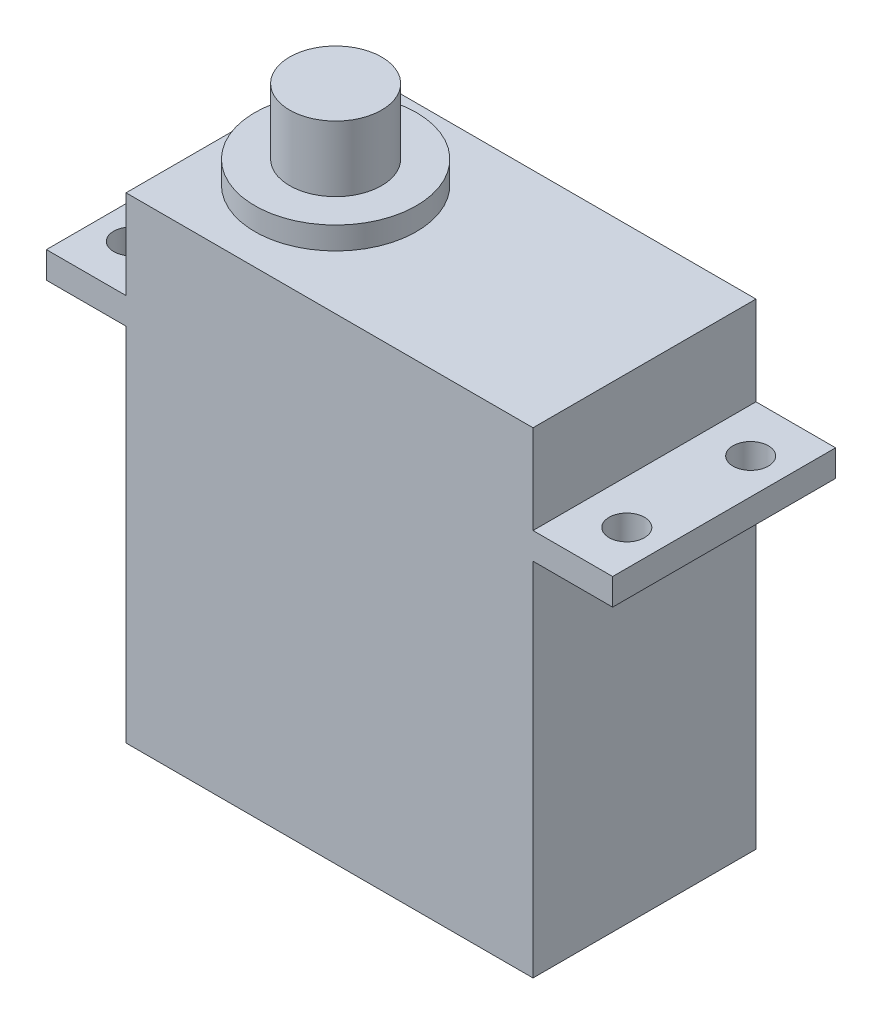
ISO-10303-21;
HEADER;
FILE_DESCRIPTION(('STEP AP214'),'2;1');
FILE_NAME('part.step','',(''),(''),'','','');
FILE_SCHEMA(('AUTOMOTIVE_DESIGN { 1 0 10303 214 1 1 1 1 }'));
ENDSEC;
DATA;
#1=APPLICATION_CONTEXT('core data for automotive mechanical design processes');
#2=APPLICATION_PROTOCOL_DEFINITION('international standard','automotive_design',2000,#1);
#3=PRODUCT_CONTEXT('',#1,'mechanical');
#4=PRODUCT('Part','Part','',(#3));
#5=PRODUCT_RELATED_PRODUCT_CATEGORY('part','',(#4));
#6=PRODUCT_DEFINITION_FORMATION('','',#4);
#7=PRODUCT_DEFINITION_CONTEXT('part definition',#1,'design');
#8=PRODUCT_DEFINITION('design','',#6,#7);
#9=PRODUCT_DEFINITION_SHAPE('','',#8);
#10=(LENGTH_UNIT() NAMED_UNIT(*) SI_UNIT(.MILLI.,.METRE.));
#11=(NAMED_UNIT(*) PLANE_ANGLE_UNIT() SI_UNIT($,.RADIAN.));
#12=(NAMED_UNIT(*) SI_UNIT($,.STERADIAN.) SOLID_ANGLE_UNIT());
#13=UNCERTAINTY_MEASURE_WITH_UNIT(LENGTH_MEASURE(1.E-05),#10,'distance_accuracy_value','');
#14=(GEOMETRIC_REPRESENTATION_CONTEXT(3) GLOBAL_UNCERTAINTY_ASSIGNED_CONTEXT((#13)) GLOBAL_UNIT_ASSIGNED_CONTEXT((#10,
#11,#12)) REPRESENTATION_CONTEXT('',''));
#15=CARTESIAN_POINT('',(0.,0.,0.));
#16=DIRECTION('',(0.,0.,1.));
#17=DIRECTION('',(1.,0.,0.));
#18=AXIS2_PLACEMENT_3D('',#15,#16,#17);
#19=CARTESIAN_POINT('',(-11.5,0.,6.3));
#20=DIRECTION('',(1.,0.,0.));
#21=DIRECTION('',(0.,0.,-1.));
#22=AXIS2_PLACEMENT_3D('',#19,#20,#21);
#23=PLANE('',#22);
#24=DIRECTION('',(0.,-1.,0.));
#25=VECTOR('',#24,1.);
#26=CARTESIAN_POINT('',(-11.5,0.,-6.3));
#27=LINE('',#26,#25);
#28=CARTESIAN_POINT('',(-11.5,13.465,-6.3));
#29=VERTEX_POINT('',#28);
#30=CARTESIAN_POINT('',(-11.5,8.435,-6.3));
#31=VERTEX_POINT('',#30);
#32=EDGE_CURVE('E156',#29,#31,#27,.T.);
#33=ORIENTED_EDGE('',*,*,#32,.T.);
#34=DIRECTION('',(0.,0.,-1.));
#35=VECTOR('',#34,1.);
#36=CARTESIAN_POINT('',(-11.5,8.435,6.3));
#37=LINE('',#36,#35);
#38=CARTESIAN_POINT('',(-11.5,8.435,6.3));
#39=VERTEX_POINT('',#38);
#40=EDGE_CURVE('E11',#39,#31,#37,.T.);
#41=ORIENTED_EDGE('',*,*,#40,.F.);
#42=DIRECTION('',(0.,-1.,0.));
#43=VECTOR('',#42,1.);
#44=CARTESIAN_POINT('',(-11.5,0.,6.3));
#45=LINE('',#44,#43);
#46=CARTESIAN_POINT('',(-11.5,13.465,6.3));
#47=VERTEX_POINT('',#46);
#48=EDGE_CURVE('E103',#47,#39,#45,.T.);
#49=ORIENTED_EDGE('',*,*,#48,.F.);
#50=DIRECTION('',(0.,0.,-1.));
#51=VECTOR('',#50,1.);
#52=CARTESIAN_POINT('',(-11.5,13.465,6.3));
#53=LINE('',#52,#51);
#54=EDGE_CURVE('E54',#47,#29,#53,.T.);
#55=ORIENTED_EDGE('',*,*,#54,.T.);
#56=EDGE_LOOP('',(#33,#41,#49,#55));
#57=FACE_BOUND('',#56,.T.);
#58=ADVANCED_FACE('F36',(#57),#23,.F.);
#59=CARTESIAN_POINT('',(0.,8.435,6.3));
#60=DIRECTION('',(0.,1.,0.));
#61=DIRECTION('',(-1.,0.,0.));
#62=AXIS2_PLACEMENT_3D('',#59,#60,#61);
#63=PLANE('',#62);
#64=CARTESIAN_POINT('',(-14.,8.435,3.5));
#65=DIRECTION('',(0.,1.,0.));
#66=DIRECTION('',(1.,0.,0.));
#67=AXIS2_PLACEMENT_3D('',#64,#65,#66);
#68=CIRCLE('',#67,1.);
#69=CARTESIAN_POINT('',(-13.,8.435,3.5));
#70=VERTEX_POINT('',#69);
#71=EDGE_CURVE('E479',#70,#70,#68,.T.);
#72=ORIENTED_EDGE('',*,*,#71,.F.);
#73=EDGE_LOOP('',(#72));
#74=FACE_BOUND('',#73,.T.);
#75=CARTESIAN_POINT('',(-14.,8.435,-3.5));
#76=DIRECTION('',(0.,1.,0.));
#77=DIRECTION('',(-1.,0.,0.));
#78=AXIS2_PLACEMENT_3D('',#75,#76,#77);
#79=CIRCLE('',#78,1.);
#80=CARTESIAN_POINT('',(-15.,8.435,-3.5));
#81=VERTEX_POINT('',#80);
#82=EDGE_CURVE('E217',#81,#81,#79,.T.);
#83=ORIENTED_EDGE('',*,*,#82,.F.);
#84=EDGE_LOOP('',(#83));
#85=FACE_BOUND('',#84,.T.);
#86=DIRECTION('',(1.,0.,0.));
#87=VECTOR('',#86,1.);
#88=CARTESIAN_POINT('',(0.,8.435,-6.3));
#89=LINE('',#88,#87);
#90=CARTESIAN_POINT('',(-16.,8.435,-6.3));
#91=VERTEX_POINT('',#90);
#92=EDGE_CURVE('E158',#91,#31,#89,.T.);
#93=ORIENTED_EDGE('',*,*,#92,.F.);
#94=DIRECTION('',(0.,0.,-1.));
#95=VECTOR('',#94,1.);
#96=CARTESIAN_POINT('',(-16.,8.435,6.3));
#97=LINE('',#96,#95);
#98=CARTESIAN_POINT('',(-16.,8.435,6.3));
#99=VERTEX_POINT('',#98);
#100=EDGE_CURVE('E45',#99,#91,#97,.T.);
#101=ORIENTED_EDGE('',*,*,#100,.F.);
#102=DIRECTION('',(1.,0.,0.));
#103=VECTOR('',#102,1.);
#104=CARTESIAN_POINT('',(0.,8.435,6.3));
#105=LINE('',#104,#103);
#106=EDGE_CURVE('E232',#99,#39,#105,.T.);
#107=ORIENTED_EDGE('',*,*,#106,.T.);
#108=ORIENTED_EDGE('',*,*,#40,.T.);
#109=EDGE_LOOP('',(#93,#101,#107,#108));
#110=FACE_BOUND('',#109,.T.);
#111=ADVANCED_FACE('F266',(#74,#85,#110),#63,.T.);
#112=CARTESIAN_POINT('',(-16.,0.,6.3));
#113=DIRECTION('',(1.,0.,0.));
#114=DIRECTION('',(0.,0.,-1.));
#115=AXIS2_PLACEMENT_3D('',#112,#113,#114);
#116=PLANE('',#115);
#117=DIRECTION('',(0.,-1.,0.));
#118=VECTOR('',#117,1.);
#119=CARTESIAN_POINT('',(-16.,0.,-6.3));
#120=LINE('',#119,#118);
#121=CARTESIAN_POINT('',(-16.,6.935,-6.3));
#122=VERTEX_POINT('',#121);
#123=EDGE_CURVE('E162',#91,#122,#120,.T.);
#124=ORIENTED_EDGE('',*,*,#123,.T.);
#125=DIRECTION('',(0.,0.,-1.));
#126=VECTOR('',#125,1.);
#127=CARTESIAN_POINT('',(-16.,6.935,6.3));
#128=LINE('',#127,#126);
#129=CARTESIAN_POINT('',(-16.,6.935,6.3));
#130=VERTEX_POINT('',#129);
#131=EDGE_CURVE('E201',#130,#122,#128,.T.);
#132=ORIENTED_EDGE('',*,*,#131,.F.);
#133=DIRECTION('',(0.,-1.,0.));
#134=VECTOR('',#133,1.);
#135=CARTESIAN_POINT('',(-16.,0.,6.3));
#136=LINE('',#135,#134);
#137=EDGE_CURVE('E235',#99,#130,#136,.T.);
#138=ORIENTED_EDGE('',*,*,#137,.F.);
#139=ORIENTED_EDGE('',*,*,#100,.T.);
#140=EDGE_LOOP('',(#124,#132,#138,#139));
#141=FACE_BOUND('',#140,.T.);
#142=ADVANCED_FACE('F270',(#141),#116,.F.);
#143=CARTESIAN_POINT('',(0.,6.935,6.3));
#144=DIRECTION('',(0.,1.,0.));
#145=DIRECTION('',(0.,0.,1.));
#146=AXIS2_PLACEMENT_3D('',#143,#144,#145);
#147=PLANE('',#146);
#148=CARTESIAN_POINT('',(-14.,6.935,3.5));
#149=DIRECTION('',(0.,1.,0.));
#150=DIRECTION('',(0.,0.,1.));
#151=AXIS2_PLACEMENT_3D('',#148,#149,#150);
#152=CIRCLE('',#151,1.);
#153=CARTESIAN_POINT('',(-14.,6.935,4.5));
#154=VERTEX_POINT('',#153);
#155=EDGE_CURVE('E39',#154,#154,#152,.T.);
#156=ORIENTED_EDGE('',*,*,#155,.T.);
#157=EDGE_LOOP('',(#156));
#158=FACE_BOUND('',#157,.T.);
#159=CARTESIAN_POINT('',(-14.,6.935,-3.5));
#160=DIRECTION('',(0.,1.,0.));
#161=DIRECTION('',(0.,0.,1.));
#162=AXIS2_PLACEMENT_3D('',#159,#160,#161);
#163=CIRCLE('',#162,1.);
#164=CARTESIAN_POINT('',(-14.,6.935,-2.5));
#165=VERTEX_POINT('',#164);
#166=EDGE_CURVE('E204',#165,#165,#163,.T.);
#167=ORIENTED_EDGE('',*,*,#166,.T.);
#168=EDGE_LOOP('',(#167));
#169=FACE_BOUND('',#168,.T.);
#170=DIRECTION('',(1.,0.,0.));
#171=VECTOR('',#170,1.);
#172=CARTESIAN_POINT('',(0.,6.935,-6.3));
#173=LINE('',#172,#171);
#174=CARTESIAN_POINT('',(-11.5,6.935,-6.3));
#175=VERTEX_POINT('',#174);
#176=EDGE_CURVE('E164',#122,#175,#173,.T.);
#177=ORIENTED_EDGE('',*,*,#176,.T.);
#178=DIRECTION('',(0.,0.,-1.));
#179=VECTOR('',#178,1.);
#180=CARTESIAN_POINT('',(-11.5,6.935,6.3));
#181=LINE('',#180,#179);
#182=CARTESIAN_POINT('',(-11.5,6.935,6.3));
#183=VERTEX_POINT('',#182);
#184=EDGE_CURVE('E198',#183,#175,#181,.T.);
#185=ORIENTED_EDGE('',*,*,#184,.F.);
#186=DIRECTION('',(1.,0.,0.));
#187=VECTOR('',#186,1.);
#188=CARTESIAN_POINT('',(0.,6.935,6.3));
#189=LINE('',#188,#187);
#190=EDGE_CURVE('E237',#130,#183,#189,.T.);
#191=ORIENTED_EDGE('',*,*,#190,.F.);
#192=ORIENTED_EDGE('',*,*,#131,.T.);
#193=EDGE_LOOP('',(#177,#185,#191,#192));
#194=FACE_BOUND('',#193,.T.);
#195=ADVANCED_FACE('F282',(#158,#169,#194),#147,.F.);
#196=CARTESIAN_POINT('',(-11.5,0.,6.3));
#197=DIRECTION('',(1.,0.,0.));
#198=DIRECTION('',(0.,0.,-1.));
#199=AXIS2_PLACEMENT_3D('',#196,#197,#198);
#200=PLANE('',#199);
#201=DIRECTION('',(0.,-1.,0.));
#202=VECTOR('',#201,1.);
#203=CARTESIAN_POINT('',(-11.5,0.,-6.3));
#204=LINE('',#203,#202);
#205=CARTESIAN_POINT('',(-11.5,-13.465,-6.3));
#206=VERTEX_POINT('',#205);
#207=EDGE_CURVE('E166',#175,#206,#204,.T.);
#208=ORIENTED_EDGE('',*,*,#207,.T.);
#209=DIRECTION('',(0.,0.,-1.));
#210=VECTOR('',#209,1.);
#211=CARTESIAN_POINT('',(-11.5,-13.465,6.3));
#212=LINE('',#211,#210);
#213=CARTESIAN_POINT('',(-11.5,-13.465,6.3));
#214=VERTEX_POINT('',#213);
#215=EDGE_CURVE('E195',#214,#206,#212,.T.);
#216=ORIENTED_EDGE('',*,*,#215,.F.);
#217=DIRECTION('',(0.,-1.,0.));
#218=VECTOR('',#217,1.);
#219=CARTESIAN_POINT('',(-11.5,0.,6.3));
#220=LINE('',#219,#218);
#221=EDGE_CURVE('E239',#183,#214,#220,.T.);
#222=ORIENTED_EDGE('',*,*,#221,.F.);
#223=ORIENTED_EDGE('',*,*,#184,.T.);
#224=EDGE_LOOP('',(#208,#216,#222,#223));
#225=FACE_BOUND('',#224,.T.);
#226=ADVANCED_FACE('F287',(#225),#200,.F.);
#227=CARTESIAN_POINT('',(0.,-13.465,6.3));
#228=DIRECTION('',(0.,1.,0.));
#229=DIRECTION('',(0.,0.,1.));
#230=AXIS2_PLACEMENT_3D('',#227,#228,#229);
#231=PLANE('',#230);
#232=DIRECTION('',(1.,0.,0.));
#233=VECTOR('',#232,1.);
#234=CARTESIAN_POINT('',(0.,-13.465,-6.3));
#235=LINE('',#234,#233);
#236=CARTESIAN_POINT('',(11.5,-13.465,-6.3));
#237=VERTEX_POINT('',#236);
#238=EDGE_CURVE('E168',#206,#237,#235,.T.);
#239=ORIENTED_EDGE('',*,*,#238,.T.);
#240=DIRECTION('',(0.,0.,-1.));
#241=VECTOR('',#240,1.);
#242=CARTESIAN_POINT('',(11.5,-13.465,6.3));
#243=LINE('',#242,#241);
#244=CARTESIAN_POINT('',(11.5,-13.465,6.3));
#245=VERTEX_POINT('',#244);
#246=EDGE_CURVE('E193',#245,#237,#243,.T.);
#247=ORIENTED_EDGE('',*,*,#246,.F.);
#248=DIRECTION('',(1.,0.,0.));
#249=VECTOR('',#248,1.);
#250=CARTESIAN_POINT('',(0.,-13.465,6.3));
#251=LINE('',#250,#249);
#252=EDGE_CURVE('E241',#214,#245,#251,.T.);
#253=ORIENTED_EDGE('',*,*,#252,.F.);
#254=ORIENTED_EDGE('',*,*,#215,.T.);
#255=EDGE_LOOP('',(#239,#247,#253,#254));
#256=FACE_BOUND('',#255,.T.);
#257=ADVANCED_FACE('F292',(#256),#231,.F.);
#258=CARTESIAN_POINT('',(11.5,0.,6.3));
#259=DIRECTION('',(1.,0.,0.));
#260=DIRECTION('',(0.,0.,-1.));
#261=AXIS2_PLACEMENT_3D('',#258,#259,#260);
#262=PLANE('',#261);
#263=DIRECTION('',(0.,-1.,0.));
#264=VECTOR('',#263,1.);
#265=CARTESIAN_POINT('',(11.5,0.,-6.3));
#266=LINE('',#265,#264);
#267=CARTESIAN_POINT('',(11.5,6.935,-6.3));
#268=VERTEX_POINT('',#267);
#269=EDGE_CURVE('E171',#268,#237,#266,.T.);
#270=ORIENTED_EDGE('',*,*,#269,.F.);
#271=DIRECTION('',(0.,0.,-1.));
#272=VECTOR('',#271,1.);
#273=CARTESIAN_POINT('',(11.5,6.935,6.3));
#274=LINE('',#273,#272);
#275=CARTESIAN_POINT('',(11.5,6.935,6.3));
#276=VERTEX_POINT('',#275);
#277=EDGE_CURVE('E191',#276,#268,#274,.T.);
#278=ORIENTED_EDGE('',*,*,#277,.F.);
#279=DIRECTION('',(0.,-1.,0.));
#280=VECTOR('',#279,1.);
#281=CARTESIAN_POINT('',(11.5,0.,6.3));
#282=LINE('',#281,#280);
#283=EDGE_CURVE('E243',#276,#245,#282,.T.);
#284=ORIENTED_EDGE('',*,*,#283,.T.);
#285=ORIENTED_EDGE('',*,*,#246,.T.);
#286=EDGE_LOOP('',(#270,#278,#284,#285));
#287=FACE_BOUND('',#286,.T.);
#288=ADVANCED_FACE('F296',(#287),#262,.T.);
#289=CARTESIAN_POINT('',(0.,6.935,6.3));
#290=DIRECTION('',(0.,1.,0.));
#291=DIRECTION('',(0.,0.,1.));
#292=AXIS2_PLACEMENT_3D('',#289,#290,#291);
#293=PLANE('',#292);
#294=CARTESIAN_POINT('',(14.,6.935,3.5));
#295=DIRECTION('',(0.,1.,0.));
#296=DIRECTION('',(0.,0.,1.));
#297=AXIS2_PLACEMENT_3D('',#294,#295,#296);
#298=CIRCLE('',#297,1.);
#299=CARTESIAN_POINT('',(14.,6.935,4.5));
#300=VERTEX_POINT('',#299);
#301=EDGE_CURVE('E206',#300,#300,#298,.T.);
#302=ORIENTED_EDGE('',*,*,#301,.T.);
#303=EDGE_LOOP('',(#302));
#304=FACE_BOUND('',#303,.T.);
#305=CARTESIAN_POINT('',(14.,6.935,-3.5));
#306=DIRECTION('',(0.,1.,0.));
#307=DIRECTION('',(0.,0.,1.));
#308=AXIS2_PLACEMENT_3D('',#305,#306,#307);
#309=CIRCLE('',#308,1.);
#310=CARTESIAN_POINT('',(14.,6.935,-2.5));
#311=VERTEX_POINT('',#310);
#312=EDGE_CURVE('E212',#311,#311,#309,.T.);
#313=ORIENTED_EDGE('',*,*,#312,.T.);
#314=EDGE_LOOP('',(#313));
#315=FACE_BOUND('',#314,.T.);
#316=DIRECTION('',(1.,0.,0.));
#317=VECTOR('',#316,1.);
#318=CARTESIAN_POINT('',(0.,6.935,-6.3));
#319=LINE('',#318,#317);
#320=CARTESIAN_POINT('',(16.,6.935,-6.3));
#321=VERTEX_POINT('',#320);
#322=EDGE_CURVE('E174',#268,#321,#319,.T.);
#323=ORIENTED_EDGE('',*,*,#322,.T.);
#324=DIRECTION('',(0.,0.,-1.));
#325=VECTOR('',#324,1.);
#326=CARTESIAN_POINT('',(16.,6.935,6.3));
#327=LINE('',#326,#325);
#328=CARTESIAN_POINT('',(16.,6.935,6.3));
#329=VERTEX_POINT('',#328);
#330=EDGE_CURVE('E189',#329,#321,#327,.T.);
#331=ORIENTED_EDGE('',*,*,#330,.F.);
#332=DIRECTION('',(1.,0.,0.));
#333=VECTOR('',#332,1.);
#334=CARTESIAN_POINT('',(0.,6.935,6.3));
#335=LINE('',#334,#333);
#336=EDGE_CURVE('E246',#276,#329,#335,.T.);
#337=ORIENTED_EDGE('',*,*,#336,.F.);
#338=ORIENTED_EDGE('',*,*,#277,.T.);
#339=EDGE_LOOP('',(#323,#331,#337,#338));
#340=FACE_BOUND('',#339,.T.);
#341=ADVANCED_FACE('F299',(#304,#315,#340),#293,.F.);
#342=CARTESIAN_POINT('',(16.,0.,6.3));
#343=DIRECTION('',(1.,0.,0.));
#344=DIRECTION('',(0.,0.,-1.));
#345=AXIS2_PLACEMENT_3D('',#342,#343,#344);
#346=PLANE('',#345);
#347=DIRECTION('',(0.,-1.,0.));
#348=VECTOR('',#347,1.);
#349=CARTESIAN_POINT('',(16.,0.,-6.3));
#350=LINE('',#349,#348);
#351=CARTESIAN_POINT('',(16.,8.435,-6.3));
#352=VERTEX_POINT('',#351);
#353=EDGE_CURVE('E177',#352,#321,#350,.T.);
#354=ORIENTED_EDGE('',*,*,#353,.F.);
#355=DIRECTION('',(0.,0.,-1.));
#356=VECTOR('',#355,1.);
#357=CARTESIAN_POINT('',(16.,8.435,6.3));
#358=LINE('',#357,#356);
#359=CARTESIAN_POINT('',(16.,8.435,6.3));
#360=VERTEX_POINT('',#359);
#361=EDGE_CURVE('E141',#360,#352,#358,.T.);
#362=ORIENTED_EDGE('',*,*,#361,.F.);
#363=DIRECTION('',(0.,-1.,0.));
#364=VECTOR('',#363,1.);
#365=CARTESIAN_POINT('',(16.,0.,6.3));
#366=LINE('',#365,#364);
#367=EDGE_CURVE('E148',#360,#329,#366,.T.);
#368=ORIENTED_EDGE('',*,*,#367,.T.);
#369=ORIENTED_EDGE('',*,*,#330,.T.);
#370=EDGE_LOOP('',(#354,#362,#368,#369));
#371=FACE_BOUND('',#370,.T.);
#372=ADVANCED_FACE('F249',(#371),#346,.T.);
#373=CARTESIAN_POINT('',(0.,8.435,6.3));
#374=DIRECTION('',(0.,1.,0.));
#375=DIRECTION('',(-1.,0.,0.));
#376=AXIS2_PLACEMENT_3D('',#373,#374,#375);
#377=PLANE('',#376);
#378=CARTESIAN_POINT('',(14.,8.435,3.5));
#379=DIRECTION('',(0.,1.,0.));
#380=DIRECTION('',(1.,0.,0.));
#381=AXIS2_PLACEMENT_3D('',#378,#379,#380);
#382=CIRCLE('',#381,1.);
#383=CARTESIAN_POINT('',(15.,8.435,3.5));
#384=VERTEX_POINT('',#383);
#385=EDGE_CURVE('E481',#384,#384,#382,.T.);
#386=ORIENTED_EDGE('',*,*,#385,.F.);
#387=EDGE_LOOP('',(#386));
#388=FACE_BOUND('',#387,.T.);
#389=CARTESIAN_POINT('',(14.,8.435,-3.5));
#390=DIRECTION('',(0.,1.,0.));
#391=DIRECTION('',(-1.,0.,0.));
#392=AXIS2_PLACEMENT_3D('',#389,#390,#391);
#393=CIRCLE('',#392,1.);
#394=CARTESIAN_POINT('',(13.,8.435,-3.5));
#395=VERTEX_POINT('',#394);
#396=EDGE_CURVE('E484',#395,#395,#393,.T.);
#397=ORIENTED_EDGE('',*,*,#396,.F.);
#398=EDGE_LOOP('',(#397));
#399=FACE_BOUND('',#398,.T.);
#400=DIRECTION('',(1.,0.,0.));
#401=VECTOR('',#400,1.);
#402=CARTESIAN_POINT('',(0.,8.435,-6.3));
#403=LINE('',#402,#401);
#404=CARTESIAN_POINT('',(11.5,8.435,-6.3));
#405=VERTEX_POINT('',#404);
#406=EDGE_CURVE('E137',#405,#352,#403,.T.);
#407=ORIENTED_EDGE('',*,*,#406,.F.);
#408=DIRECTION('',(0.,0.,-1.));
#409=VECTOR('',#408,1.);
#410=CARTESIAN_POINT('',(11.5,8.435,6.3));
#411=LINE('',#410,#409);
#412=CARTESIAN_POINT('',(11.5,8.435,6.3));
#413=VERTEX_POINT('',#412);
#414=EDGE_CURVE('E132',#413,#405,#411,.T.);
#415=ORIENTED_EDGE('',*,*,#414,.F.);
#416=DIRECTION('',(1.,0.,0.));
#417=VECTOR('',#416,1.);
#418=CARTESIAN_POINT('',(0.,8.435,6.3));
#419=LINE('',#418,#417);
#420=EDGE_CURVE('E135',#413,#360,#419,.T.);
#421=ORIENTED_EDGE('',*,*,#420,.T.);
#422=ORIENTED_EDGE('',*,*,#361,.T.);
#423=EDGE_LOOP('',(#407,#415,#421,#422));
#424=FACE_BOUND('',#423,.T.);
#425=ADVANCED_FACE('F134',(#388,#399,#424),#377,.T.);
#426=CARTESIAN_POINT('',(11.5,0.,6.3));
#427=DIRECTION('',(1.,0.,0.));
#428=DIRECTION('',(0.,0.,-1.));
#429=AXIS2_PLACEMENT_3D('',#426,#427,#428);
#430=PLANE('',#429);
#431=DIRECTION('',(0.,-1.,0.));
#432=VECTOR('',#431,1.);
#433=CARTESIAN_POINT('',(11.5,0.,-6.3));
#434=LINE('',#433,#432);
#435=CARTESIAN_POINT('',(11.5,13.465,-6.3));
#436=VERTEX_POINT('',#435);
#437=EDGE_CURVE('E181',#436,#405,#434,.T.);
#438=ORIENTED_EDGE('',*,*,#437,.F.);
#439=DIRECTION('',(0.,0.,-1.));
#440=VECTOR('',#439,1.);
#441=CARTESIAN_POINT('',(11.5,13.465,6.3));
#442=LINE('',#441,#440);
#443=CARTESIAN_POINT('',(11.5,13.465,6.3));
#444=VERTEX_POINT('',#443);
#445=EDGE_CURVE('E91',#444,#436,#442,.T.);
#446=ORIENTED_EDGE('',*,*,#445,.F.);
#447=DIRECTION('',(0.,-1.,0.));
#448=VECTOR('',#447,1.);
#449=CARTESIAN_POINT('',(11.5,0.,6.3));
#450=LINE('',#449,#448);
#451=EDGE_CURVE('E146',#444,#413,#450,.T.);
#452=ORIENTED_EDGE('',*,*,#451,.T.);
#453=ORIENTED_EDGE('',*,*,#414,.T.);
#454=EDGE_LOOP('',(#438,#446,#452,#453));
#455=FACE_BOUND('',#454,.T.);
#456=ADVANCED_FACE('F150',(#455),#430,.T.);
#457=CARTESIAN_POINT('',(0.,13.465,6.3));
#458=DIRECTION('',(0.,1.,0.));
#459=DIRECTION('',(0.,0.,1.));
#460=AXIS2_PLACEMENT_3D('',#457,#458,#459);
#461=PLANE('',#460);
#462=CARTESIAN_POINT('',(-5.955,13.465,0.));
#463=DIRECTION('',(0.,-1.,0.));
#464=DIRECTION('',(0.,0.,-1.));
#465=AXIS2_PLACEMENT_3D('',#462,#463,#464);
#466=CIRCLE('',#465,4.565);
#467=CARTESIAN_POINT('',(-5.955,13.465,-4.565));
#468=VERTEX_POINT('',#467);
#469=EDGE_CURVE('E159',#468,#468,#466,.T.);
#470=ORIENTED_EDGE('',*,*,#469,.T.);
#471=EDGE_LOOP('',(#470));
#472=FACE_BOUND('',#471,.T.);
#473=DIRECTION('',(1.,0.,0.));
#474=VECTOR('',#473,1.);
#475=CARTESIAN_POINT('',(0.,13.465,-6.3));
#476=LINE('',#475,#474);
#477=EDGE_CURVE('E183',#29,#436,#476,.T.);
#478=ORIENTED_EDGE('',*,*,#477,.F.);
#479=ORIENTED_EDGE('',*,*,#54,.F.);
#480=DIRECTION('',(1.,0.,0.));
#481=VECTOR('',#480,1.);
#482=CARTESIAN_POINT('',(0.,13.465,6.3));
#483=LINE('',#482,#481);
#484=EDGE_CURVE('E151',#47,#444,#483,.T.);
#485=ORIENTED_EDGE('',*,*,#484,.T.);
#486=ORIENTED_EDGE('',*,*,#445,.T.);
#487=EDGE_LOOP('',(#478,#479,#485,#486));
#488=FACE_BOUND('',#487,.T.);
#489=ADVANCED_FACE('F254',(#472,#488),#461,.T.);
#490=CARTESIAN_POINT('',(0.,0.,6.3));
#491=DIRECTION('',(0.,0.,1.));
#492=DIRECTION('',(1.,0.,0.));
#493=AXIS2_PLACEMENT_3D('',#490,#491,#492);
#494=PLANE('',#493);
#495=ORIENTED_EDGE('',*,*,#48,.T.);
#496=ORIENTED_EDGE('',*,*,#106,.F.);
#497=ORIENTED_EDGE('',*,*,#137,.T.);
#498=ORIENTED_EDGE('',*,*,#190,.T.);
#499=ORIENTED_EDGE('',*,*,#221,.T.);
#500=ORIENTED_EDGE('',*,*,#252,.T.);
#501=ORIENTED_EDGE('',*,*,#283,.F.);
#502=ORIENTED_EDGE('',*,*,#336,.T.);
#503=ORIENTED_EDGE('',*,*,#367,.F.);
#504=ORIENTED_EDGE('',*,*,#420,.F.);
#505=ORIENTED_EDGE('',*,*,#451,.F.);
#506=ORIENTED_EDGE('',*,*,#484,.F.);
#507=EDGE_LOOP('',(#495,#496,#497,#498,#499,#500,#501,#502,#503,#504,#505,#506));
#508=FACE_BOUND('',#507,.T.);
#509=ADVANCED_FACE('F145',(#508),#494,.T.);
#510=CARTESIAN_POINT('',(0.,0.,-6.3));
#511=DIRECTION('',(0.,0.,1.));
#512=DIRECTION('',(1.,0.,0.));
#513=AXIS2_PLACEMENT_3D('',#510,#511,#512);
#514=PLANE('',#513);
#515=ORIENTED_EDGE('',*,*,#32,.F.);
#516=ORIENTED_EDGE('',*,*,#477,.T.);
#517=ORIENTED_EDGE('',*,*,#437,.T.);
#518=ORIENTED_EDGE('',*,*,#406,.T.);
#519=ORIENTED_EDGE('',*,*,#353,.T.);
#520=ORIENTED_EDGE('',*,*,#322,.F.);
#521=ORIENTED_EDGE('',*,*,#269,.T.);
#522=ORIENTED_EDGE('',*,*,#238,.F.);
#523=ORIENTED_EDGE('',*,*,#207,.F.);
#524=ORIENTED_EDGE('',*,*,#176,.F.);
#525=ORIENTED_EDGE('',*,*,#123,.F.);
#526=ORIENTED_EDGE('',*,*,#92,.T.);
#527=EDGE_LOOP('',(#515,#516,#517,#518,#519,#520,#521,#522,#523,#524,#525,#526));
#528=FACE_BOUND('',#527,.T.);
#529=ADVANCED_FACE('F253',(#528),#514,.F.);
#530=CARTESIAN_POINT('',(-5.955,10.8397445311835,0.));
#531=DIRECTION('',(0.,-1.,0.));
#532=DIRECTION('',(0.,0.,-1.));
#533=AXIS2_PLACEMENT_3D('',#530,#531,#532);
#534=CYLINDRICAL_SURFACE('',#533,4.565);
#535=ORIENTED_EDGE('',*,*,#469,.F.);
#536=EDGE_LOOP('',(#535));
#537=FACE_BOUND('',#536,.T.);
#538=CARTESIAN_POINT('',(-5.955,14.735,0.));
#539=DIRECTION('',(0.,-1.,0.));
#540=DIRECTION('',(0.,0.,-1.));
#541=AXIS2_PLACEMENT_3D('',#538,#539,#540);
#542=CIRCLE('',#541,4.565);
#543=CARTESIAN_POINT('',(-5.955,14.735,-4.565));
#544=VERTEX_POINT('',#543);
#545=EDGE_CURVE('E226',#544,#544,#542,.T.);
#546=ORIENTED_EDGE('',*,*,#545,.T.);
#547=EDGE_LOOP('',(#546));
#548=FACE_BOUND('',#547,.T.);
#549=ADVANCED_FACE('F371',(#537,#548),#534,.T.);
#550=CARTESIAN_POINT('',(-10.52,14.735,0.));
#551=DIRECTION('',(0.,-1.,0.));
#552=DIRECTION('',(0.,0.,-1.));
#553=AXIS2_PLACEMENT_3D('',#550,#551,#552);
#554=PLANE('',#553);
#555=ORIENTED_EDGE('',*,*,#545,.F.);
#556=EDGE_LOOP('',(#555));
#557=FACE_BOUND('',#556,.T.);
#558=CARTESIAN_POINT('',(-5.955,14.735,0.));
#559=DIRECTION('',(0.,-1.,0.));
#560=DIRECTION('',(0.,0.,-1.));
#561=AXIS2_PLACEMENT_3D('',#558,#559,#560);
#562=CIRCLE('',#561,2.6);
#563=CARTESIAN_POINT('',(-5.955,14.735,-2.6));
#564=VERTEX_POINT('',#563);
#565=EDGE_CURVE('E223',#564,#564,#562,.T.);
#566=ORIENTED_EDGE('',*,*,#565,.T.);
#567=EDGE_LOOP('',(#566));
#568=FACE_BOUND('',#567,.T.);
#569=ADVANCED_FACE('F385',(#557,#568),#554,.F.);
#570=CARTESIAN_POINT('',(-5.955,10.8397445311835,0.));
#571=DIRECTION('',(0.,-1.,0.));
#572=DIRECTION('',(0.,0.,-1.));
#573=AXIS2_PLACEMENT_3D('',#570,#571,#572);
#574=CYLINDRICAL_SURFACE('',#573,2.6);
#575=ORIENTED_EDGE('',*,*,#565,.F.);
#576=EDGE_LOOP('',(#575));
#577=FACE_BOUND('',#576,.T.);
#578=CARTESIAN_POINT('',(-5.955,18.435,0.));
#579=DIRECTION('',(0.,-1.,0.));
#580=DIRECTION('',(0.,0.,-1.));
#581=AXIS2_PLACEMENT_3D('',#578,#579,#580);
#582=CIRCLE('',#581,2.6);
#583=CARTESIAN_POINT('',(-5.955,18.435,-2.6));
#584=VERTEX_POINT('',#583);
#585=EDGE_CURVE('E210',#584,#584,#582,.T.);
#586=ORIENTED_EDGE('',*,*,#585,.T.);
#587=EDGE_LOOP('',(#586));
#588=FACE_BOUND('',#587,.T.);
#589=ADVANCED_FACE('F395',(#577,#588),#574,.T.);
#590=CARTESIAN_POINT('',(-8.555,18.435,0.));
#591=DIRECTION('',(0.,-1.,0.));
#592=DIRECTION('',(0.,0.,-1.));
#593=AXIS2_PLACEMENT_3D('',#590,#591,#592);
#594=PLANE('',#593);
#595=ORIENTED_EDGE('',*,*,#585,.F.);
#596=EDGE_LOOP('',(#595));
#597=FACE_BOUND('',#596,.T.);
#598=ADVANCED_FACE('F405',(#597),#594,.F.);
#599=CARTESIAN_POINT('',(14.,-1.565,-3.5));
#600=DIRECTION('',(0.,1.,0.));
#601=DIRECTION('',(-1.,0.,0.));
#602=AXIS2_PLACEMENT_3D('',#599,#600,#601);
#603=CYLINDRICAL_SURFACE('',#602,1.);
#604=ORIENTED_EDGE('',*,*,#396,.T.);
#605=EDGE_LOOP('',(#604));
#606=FACE_BOUND('',#605,.T.);
#607=ORIENTED_EDGE('',*,*,#312,.F.);
#608=EDGE_LOOP('',(#607));
#609=FACE_BOUND('',#608,.T.);
#610=ADVANCED_FACE('F414',(#606,#609),#603,.F.);
#611=CARTESIAN_POINT('',(14.,-1.565,3.5));
#612=DIRECTION('',(0.,1.,0.));
#613=DIRECTION('',(-1.,0.,0.));
#614=AXIS2_PLACEMENT_3D('',#611,#612,#613);
#615=CYLINDRICAL_SURFACE('',#614,1.);
#616=ORIENTED_EDGE('',*,*,#385,.T.);
#617=EDGE_LOOP('',(#616));
#618=FACE_BOUND('',#617,.T.);
#619=ORIENTED_EDGE('',*,*,#301,.F.);
#620=EDGE_LOOP('',(#619));
#621=FACE_BOUND('',#620,.T.);
#622=ADVANCED_FACE('F441',(#618,#621),#615,.F.);
#623=CARTESIAN_POINT('',(-14.,-1.565,-3.5));
#624=DIRECTION('',(0.,1.,0.));
#625=DIRECTION('',(-1.,0.,0.));
#626=AXIS2_PLACEMENT_3D('',#623,#624,#625);
#627=CYLINDRICAL_SURFACE('',#626,1.);
#628=ORIENTED_EDGE('',*,*,#82,.T.);
#629=EDGE_LOOP('',(#628));
#630=FACE_BOUND('',#629,.T.);
#631=ORIENTED_EDGE('',*,*,#166,.F.);
#632=EDGE_LOOP('',(#631));
#633=FACE_BOUND('',#632,.T.);
#634=ADVANCED_FACE('F449',(#630,#633),#627,.F.);
#635=CARTESIAN_POINT('',(-14.,-1.565,3.5));
#636=DIRECTION('',(0.,1.,0.));
#637=DIRECTION('',(-1.,0.,0.));
#638=AXIS2_PLACEMENT_3D('',#635,#636,#637);
#639=CYLINDRICAL_SURFACE('',#638,1.);
#640=ORIENTED_EDGE('',*,*,#71,.T.);
#641=EDGE_LOOP('',(#640));
#642=FACE_BOUND('',#641,.T.);
#643=ORIENTED_EDGE('',*,*,#155,.F.);
#644=EDGE_LOOP('',(#643));
#645=FACE_BOUND('',#644,.T.);
#646=ADVANCED_FACE('F457',(#642,#645),#639,.F.);
#647=CLOSED_SHELL('',(#58,#111,#142,#195,#226,#257,#288,#341,#372,#425,#456,#489,#509,#529,#549,
#569,#589,#598,#610,#622,#634,#646));
#648=MANIFOLD_SOLID_BREP('B2',#647);
#649=ADVANCED_BREP_SHAPE_REPRESENTATION('',(#18,#648),#14);
#650=SHAPE_DEFINITION_REPRESENTATION(#9,#649);
ENDSEC;
END-ISO-10303-21;
